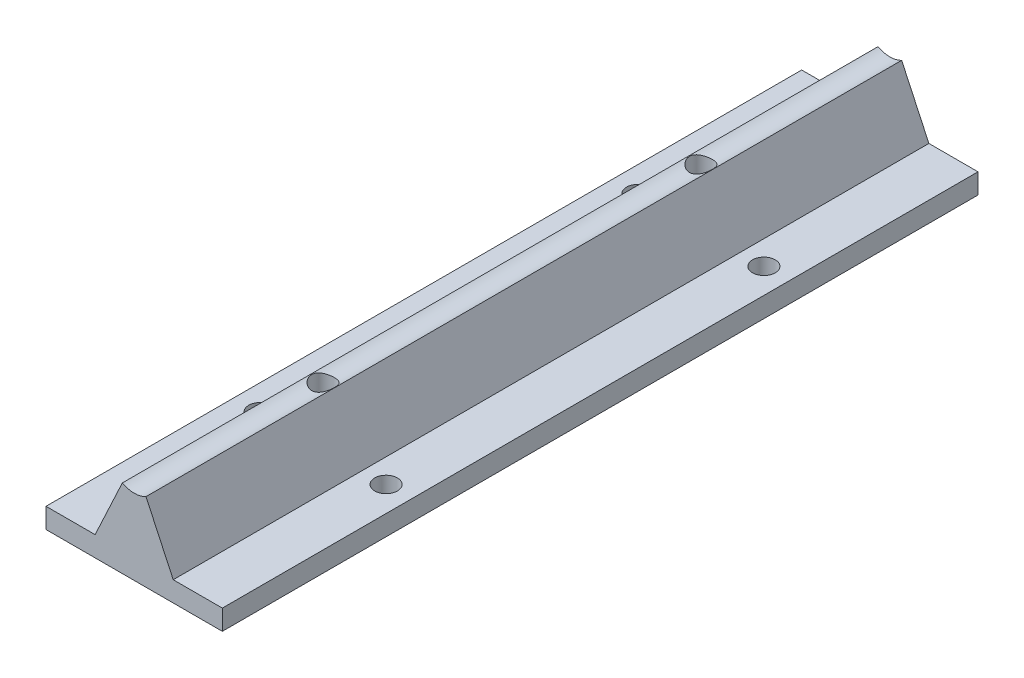
ISO-10303-21;
HEADER;
FILE_DESCRIPTION(('STEP AP214'),'2;1');
FILE_NAME('part.step','',(''),(''),'','','');
FILE_SCHEMA(('AUTOMOTIVE_DESIGN { 1 0 10303 214 1 1 1 1 }'));
ENDSEC;
DATA;
#1=APPLICATION_CONTEXT('core data for automotive mechanical design processes');
#2=APPLICATION_PROTOCOL_DEFINITION('international standard','automotive_design',2000,#1);
#3=PRODUCT_CONTEXT('',#1,'mechanical');
#4=PRODUCT('Part','Part','',(#3));
#5=PRODUCT_RELATED_PRODUCT_CATEGORY('part','',(#4));
#6=PRODUCT_DEFINITION_FORMATION('','',#4);
#7=PRODUCT_DEFINITION_CONTEXT('part definition',#1,'design');
#8=PRODUCT_DEFINITION('design','',#6,#7);
#9=PRODUCT_DEFINITION_SHAPE('','',#8);
#10=(LENGTH_UNIT() NAMED_UNIT(*) SI_UNIT(.MILLI.,.METRE.));
#11=(NAMED_UNIT(*) PLANE_ANGLE_UNIT() SI_UNIT($,.RADIAN.));
#12=(NAMED_UNIT(*) SI_UNIT($,.STERADIAN.) SOLID_ANGLE_UNIT());
#13=UNCERTAINTY_MEASURE_WITH_UNIT(LENGTH_MEASURE(1.E-05),#10,'distance_accuracy_value','');
#14=(GEOMETRIC_REPRESENTATION_CONTEXT(3) GLOBAL_UNCERTAINTY_ASSIGNED_CONTEXT((#13)) GLOBAL_UNIT_ASSIGNED_CONTEXT((#10,
#11,#12)) REPRESENTATION_CONTEXT('',''));
#15=CARTESIAN_POINT('',(0.,0.,0.));
#16=DIRECTION('',(0.,0.,1.));
#17=DIRECTION('',(1.,0.,0.));
#18=AXIS2_PLACEMENT_3D('',#15,#16,#17);
#19=CARTESIAN_POINT('',(0.,0.,-150.));
#20=DIRECTION('',(0.,0.,1.));
#21=DIRECTION('',(1.,0.,0.));
#22=AXIS2_PLACEMENT_3D('',#19,#20,#21);
#23=CYLINDRICAL_SURFACE('',#22,5.);
#24=CARTESIAN_POINT('',(2.25,-4.46514277487294,-37.5));
#25=CARTESIAN_POINT('',(2.24999304031583,-4.46515039872742,-37.3810387872691));
#26=CARTESIAN_POINT('',(2.24050444334664,-4.4699666726898,-37.2618852197389));
#27=CARTESIAN_POINT('',(2.20296952025722,-4.48857891323592,-37.0271018284973));
#28=CARTESIAN_POINT('',(2.17487687589,-4.50239729083484,-36.9114815551227));
#29=CARTESIAN_POINT('',(2.10149811494296,-4.53710585458752,-36.6875840285442));
#30=CARTESIAN_POINT('',(2.05629003690716,-4.55796389692775,-36.579276037285));
#31=CARTESIAN_POINT('',(1.95019826041788,-4.6043530345761,-36.371809245018));
#32=CARTESIAN_POINT('',(1.88931647308661,-4.62988356005072,-36.2726493305705));
#33=CARTESIAN_POINT('',(1.74886682448111,-4.6848168738739,-36.0790152310073));
#34=CARTESIAN_POINT('',(1.66832919766814,-4.71436409953233,-35.9852850632113));
#35=CARTESIAN_POINT('',(1.49288314705885,-4.77282391954203,-35.8121009236461));
#36=CARTESIAN_POINT('',(1.39796864967689,-4.80173623973545,-35.7326530166617));
#37=CARTESIAN_POINT('',(1.19040340238111,-4.85747480215182,-35.5862642005538));
#38=CARTESIAN_POINT('',(1.0770863493284,-4.88411395697375,-35.5201902456851));
#39=CARTESIAN_POINT('',(0.839526009772626,-4.93049745168418,-35.4083730190249));
#40=CARTESIAN_POINT('',(0.715288381409388,-4.95024533600557,-35.3626192924835));
#41=CARTESIAN_POINT('',(0.467253632116483,-4.97959116820759,-35.2955312718054));
#42=CARTESIAN_POINT('',(0.343870281116731,-4.98972320525301,-35.2729058054981));
#43=CARTESIAN_POINT('',(0.0946715176300412,-5.00065622282591,-35.2485139386555));
#44=CARTESIAN_POINT('',(-0.0311427027271375,-5.00146166644926,-35.2467375611082));
#45=CARTESIAN_POINT('',(-0.272124930597736,-4.99394241822247,-35.2634846149598));
#46=CARTESIAN_POINT('',(-0.387416232492517,-4.98625984599743,-35.2805802947329));
#47=CARTESIAN_POINT('',(-0.613288459239055,-4.96354367577184,-35.3320981851849));
#48=CARTESIAN_POINT('',(-0.723869034338141,-4.94850953297701,-35.3665216799616));
#49=CARTESIAN_POINT('',(-0.939228995401037,-4.91222614034771,-35.4520780505759));
#50=CARTESIAN_POINT('',(-1.04389475376014,-4.8908859566015,-35.5034567865346));
#51=CARTESIAN_POINT('',(-1.24339321925694,-4.84401587857545,-35.6211962951282));
#52=CARTESIAN_POINT('',(-1.3382223125092,-4.81848445331244,-35.6875625457658));
#53=CARTESIAN_POINT('',(-1.52345175293302,-4.76331481407976,-35.8395558357204));
#54=CARTESIAN_POINT('',(-1.61288673432273,-4.73351145466938,-35.92630082335));
#55=CARTESIAN_POINT('',(-1.77639992608746,-4.67460929075157,-36.1135073005329));
#56=CARTESIAN_POINT('',(-1.85047011655517,-4.6455108611573,-36.2139759082102));
#57=CARTESIAN_POINT('',(-1.9842398101775,-4.59001891824128,-36.4312356755283));
#58=CARTESIAN_POINT('',(-2.04317215242966,-4.56379860249299,-36.548547437004));
#59=CARTESIAN_POINT('',(-2.14003834281189,-4.51919374197597,-36.7929140470942));
#60=CARTESIAN_POINT('',(-2.17799005773757,-4.50080253313332,-36.919960500469));
#61=CARTESIAN_POINT('',(-2.22914248632389,-4.47567706017381,-37.1704937388217));
#62=CARTESIAN_POINT('',(-2.24392437246759,-4.46820077828806,-37.2935813806313));
#63=CARTESIAN_POINT('',(-2.25302242470034,-4.46362263539942,-37.5406793100698));
#64=CARTESIAN_POINT('',(-2.2473478942298,-4.46651605832117,-37.664689152686));
#65=CARTESIAN_POINT('',(-2.21714216163569,-4.48157509018498,-37.8996001648764));
#66=CARTESIAN_POINT('',(-2.19415743855621,-4.49297960430386,-38.0107558097788));
#67=CARTESIAN_POINT('',(-2.13212542419366,-4.52274424903303,-38.2274996545956));
#68=CARTESIAN_POINT('',(-2.09307393216707,-4.54110619860308,-38.3330863903371));
#69=CARTESIAN_POINT('',(-1.99809284583429,-4.58371481317643,-38.5410481707792));
#70=CARTESIAN_POINT('',(-1.94148122987605,-4.60818960972128,-38.6430633649459));
#71=CARTESIAN_POINT('',(-1.81362927889096,-4.65998955680979,-38.8366836138209));
#72=CARTESIAN_POINT('',(-1.74238196666509,-4.68731606376624,-38.9282836708995));
#73=CARTESIAN_POINT('',(-1.57908877421524,-4.74496334454854,-39.1078255379359));
#74=CARTESIAN_POINT('',(-1.48568977503588,-4.77531541652934,-39.194531895157));
#75=CARTESIAN_POINT('',(-1.28502997436725,-4.8331762481073,-39.351326543911));
#76=CARTESIAN_POINT('',(-1.17776699723161,-4.86068456021687,-39.4214122222902));
#77=CARTESIAN_POINT('',(-0.950682209086048,-4.91017542897077,-39.5433961414959));
#78=CARTESIAN_POINT('',(-0.830745952505896,-4.93210022008002,-39.5951062823748));
#79=CARTESIAN_POINT('',(-0.582619539391229,-4.96751583574373,-39.6771762488785));
#80=CARTESIAN_POINT('',(-0.454435271872218,-4.98101260572729,-39.7075511270571));
#81=CARTESIAN_POINT('',(-0.204394813787128,-4.99726613498169,-39.7439710415703));
#82=CARTESIAN_POINT('',(-0.0828396086643638,-5.00078768109045,-39.7517498349332));
#83=CARTESIAN_POINT('',(0.159848279708581,-4.99891579804308,-39.7475911911414));
#84=CARTESIAN_POINT('',(0.280981054375446,-4.99352443536979,-39.7356583241909));
#85=CARTESIAN_POINT('',(0.513549488452865,-4.97486307031119,-39.6936476316652));
#86=CARTESIAN_POINT('',(0.625174452755547,-4.96196940870592,-39.6644355034439));
#87=CARTESIAN_POINT('',(0.841845251095443,-4.92983796875448,-39.589721662337));
#88=CARTESIAN_POINT('',(0.946889948144515,-4.9105990976134,-39.5442171434013));
#89=CARTESIAN_POINT('',(1.1527517065352,-4.86649288960106,-39.4359251090506));
#90=CARTESIAN_POINT('',(1.25315478757822,-4.84140812281739,-39.3724414763288));
#91=CARTESIAN_POINT('',(1.4423245633934,-4.78846161065104,-39.2309445814171));
#92=CARTESIAN_POINT('',(1.53108621316286,-4.76059867044869,-39.1529250550821));
#93=CARTESIAN_POINT('',(1.70196716671107,-4.70235094807989,-38.9771636475261));
#94=CARTESIAN_POINT('',(1.78296764783157,-4.67194455656386,-38.8783366721409));
#95=CARTESIAN_POINT('',(1.92749297632142,-4.61420006725822,-38.6677352006364));
#96=CARTESIAN_POINT('',(1.99100658915978,-4.58686394862663,-38.5559524462233));
#97=CARTESIAN_POINT('',(2.09879543180337,-4.53856864513167,-38.3211515361848));
#98=CARTESIAN_POINT('',(2.14295192965231,-4.51764904631087,-38.19806949051));
#99=CARTESIAN_POINT('',(2.19275164773714,-4.49356898894665,-38.0085450162447));
#100=CARTESIAN_POINT('',(2.20660710269014,-4.48676181351279,-37.9446151097391));
#101=CARTESIAN_POINT('',(2.22871677888322,-4.47582163437334,-37.8155836028458));
#102=CARTESIAN_POINT('',(2.23697517989221,-4.47168663524699,-37.7504829141542));
#103=CARTESIAN_POINT('',(2.2449126944791,-4.46770340658946,-37.6543423353983));
#104=CARTESIAN_POINT('',(2.24681915664303,-4.46674464896162,-37.6235140886301));
#105=CARTESIAN_POINT('',(2.24936373361879,-4.46546333269431,-37.5617948896694));
#106=CARTESIAN_POINT('',(2.25000180799797,-4.46514079433574,-37.5309039355094));
#107=CARTESIAN_POINT('',(2.25,-4.46514277487294,-37.5));
#108=B_SPLINE_CURVE_WITH_KNOTS('',3,(#24,#25,#26,#27,#28,#29,#30,#31,#32,#33,#34,#35,#36,#37,
#38,#39,#40,#41,#42,#43,#44,#45,#46,#47,#48,#49,#50,#51,#52,#53,#54,#55,#56,#57,#58,#59,#60,#61,
#62,#63,#64,#65,#66,#67,#68,#69,#70,#71,#72,#73,#74,#75,#76,#77,#78,#79,#80,#81,#82,#83,#84,#85,
#86,#87,#88,#89,#90,#91,#92,#93,#94,#95,#96,#97,#98,#99,#100,#101,#102,#103,#104,#105,#106,
#107),.UNSPECIFIED.,.T.,.F.,(4,2,2,2,2,2,2,2,2,2,2,2,2,2,2,2,2,2,2,2,2,2,2,2,2,2,2,2,2,2,2,2,2,
2,2,2,2,2,2,2,2,4),(0.,0.356759742987548,0.714411062073144,1.07045091984824,1.42644738561851,
1.80599601944598,2.18570544513355,2.58519198578237,2.98447275197118,3.35999219707463,
3.73533193577185,4.08410830185014,4.43291051821014,4.78701075889259,5.14124063485553,
5.52388400014615,5.90672659268635,6.30625734447515,6.70544733553703,7.0759816733518,
7.44634751591088,7.78705357899948,8.12784877819472,8.48402022975506,8.84036187276862,
9.23157909435329,9.62285778358307,10.0180336177098,10.412930364732,10.7766046049827,
11.1401945381678,11.4869501554105,11.8337655233701,12.1964652511595,12.5593216450042,
12.9515422543472,13.3440142630044,13.7388610212111,13.9359176589375,14.1328269760451,
14.2255036426529,14.318183263485),.UNSPECIFIED.);
#109=CARTESIAN_POINT('',(2.25,-4.46514277487294,-37.5));
#110=VERTEX_POINT('',#109);
#111=EDGE_CURVE('E45',#110,#110,#108,.T.);
#112=ORIENTED_EDGE('',*,*,#111,.T.);
#113=EDGE_LOOP('',(#112));
#114=FACE_BOUND('',#113,.T.);
#115=CARTESIAN_POINT('',(0.,0.,0.));
#116=DIRECTION('',(0.,0.,-1.));
#117=DIRECTION('',(1.,0.,0.));
#118=AXIS2_PLACEMENT_3D('',#115,#116,#117);
#119=CIRCLE('',#118,5.);
#120=CARTESIAN_POINT('',(2.35,-4.41333207452147,0.));
#121=VERTEX_POINT('',#120);
#122=CARTESIAN_POINT('',(-2.35,-4.41333207452147,0.));
#123=VERTEX_POINT('',#122);
#124=EDGE_CURVE('E136',#121,#123,#119,.T.);
#125=ORIENTED_EDGE('',*,*,#124,.F.);
#126=DIRECTION('',(0.,0.,1.));
#127=VECTOR('',#126,1.);
#128=CARTESIAN_POINT('',(2.35,-4.41333207452147,-150.));
#129=LINE('',#128,#127);
#130=CARTESIAN_POINT('',(2.35,-4.41333207452147,-150.));
#131=VERTEX_POINT('',#130);
#132=EDGE_CURVE('E53',#131,#121,#129,.T.);
#133=ORIENTED_EDGE('',*,*,#132,.F.);
#134=CARTESIAN_POINT('',(0.,0.,-150.));
#135=DIRECTION('',(0.,0.,-1.));
#136=DIRECTION('',(1.,0.,0.));
#137=AXIS2_PLACEMENT_3D('',#134,#135,#136);
#138=CIRCLE('',#137,5.);
#139=CARTESIAN_POINT('',(-2.35,-4.41333207452147,-150.));
#140=VERTEX_POINT('',#139);
#141=EDGE_CURVE('E158',#131,#140,#138,.T.);
#142=ORIENTED_EDGE('',*,*,#141,.T.);
#143=DIRECTION('',(0.,0.,1.));
#144=VECTOR('',#143,1.);
#145=CARTESIAN_POINT('',(-2.35,-4.41333207452147,-150.));
#146=LINE('',#145,#144);
#147=EDGE_CURVE('E94',#140,#123,#146,.T.);
#148=ORIENTED_EDGE('',*,*,#147,.T.);
#149=EDGE_LOOP('',(#125,#133,#142,#148));
#150=FACE_BOUND('',#149,.T.);
#151=CARTESIAN_POINT('',(2.25,-4.46514277487294,-112.5));
#152=CARTESIAN_POINT('',(2.24999304031583,-4.46515039872742,-112.381038787269));
#153=CARTESIAN_POINT('',(2.24050444334664,-4.4699666726898,-112.261885219739));
#154=CARTESIAN_POINT('',(2.20296952025721,-4.48857891323592,-112.027101828497));
#155=CARTESIAN_POINT('',(2.17487687588999,-4.50239729083484,-111.911481555123));
#156=CARTESIAN_POINT('',(2.10149811494296,-4.53710585458752,-111.687584028544));
#157=CARTESIAN_POINT('',(2.05629003690716,-4.55796389692775,-111.579276037285));
#158=CARTESIAN_POINT('',(1.95019826041789,-4.6043530345761,-111.371809245018));
#159=CARTESIAN_POINT('',(1.88931647308662,-4.62988356005071,-111.27264933057));
#160=CARTESIAN_POINT('',(1.74886682448113,-4.6848168738739,-111.079015231007));
#161=CARTESIAN_POINT('',(1.66832919766816,-4.71436409953233,-110.985285063211));
#162=CARTESIAN_POINT('',(1.49288314705886,-4.77282391954203,-110.812100923646));
#163=CARTESIAN_POINT('',(1.3979686496769,-4.80173623973545,-110.732653016662));
#164=CARTESIAN_POINT('',(1.19040340238111,-4.85747480215182,-110.586264200554));
#165=CARTESIAN_POINT('',(1.07708634932839,-4.88411395697375,-110.520190245685));
#166=CARTESIAN_POINT('',(0.839526009772622,-4.93049745168418,-110.408373019025));
#167=CARTESIAN_POINT('',(0.715288381409382,-4.95024533600557,-110.362619292483));
#168=CARTESIAN_POINT('',(0.467253632116477,-4.97959116820759,-110.295531271805));
#169=CARTESIAN_POINT('',(0.343870281116728,-4.98972320525301,-110.272905805498));
#170=CARTESIAN_POINT('',(0.0946715176300411,-5.00065622282591,-110.248513938655));
#171=CARTESIAN_POINT('',(-0.0311427027271368,-5.00146166644926,-110.246737561108));
#172=CARTESIAN_POINT('',(-0.272124930597734,-4.99394241822247,-110.26348461496));
#173=CARTESIAN_POINT('',(-0.387416232492514,-4.98625984599743,-110.280580294733));
#174=CARTESIAN_POINT('',(-0.613288459239052,-4.96354367577184,-110.332098185185));
#175=CARTESIAN_POINT('',(-0.723869034338138,-4.94850953297701,-110.366521679962));
#176=CARTESIAN_POINT('',(-0.939228995401038,-4.91222614034771,-110.452078050576));
#177=CARTESIAN_POINT('',(-1.04389475376015,-4.89088595660149,-110.503456786535));
#178=CARTESIAN_POINT('',(-1.24339321925695,-4.84401587857545,-110.621196295128));
#179=CARTESIAN_POINT('',(-1.3382223125092,-4.81848445331244,-110.687562545766));
#180=CARTESIAN_POINT('',(-1.52345175293302,-4.76331481407976,-110.83955583572));
#181=CARTESIAN_POINT('',(-1.61288673432273,-4.73351145466938,-110.92630082335));
#182=CARTESIAN_POINT('',(-1.77639992608746,-4.67460929075157,-111.113507300533));
#183=CARTESIAN_POINT('',(-1.85047011655517,-4.6455108611573,-111.21397590821));
#184=CARTESIAN_POINT('',(-1.9842398101775,-4.59001891824128,-111.431235675528));
#185=CARTESIAN_POINT('',(-2.04317215242967,-4.56379860249299,-111.548547437004));
#186=CARTESIAN_POINT('',(-2.1400383428119,-4.51919374197597,-111.792914047094));
#187=CARTESIAN_POINT('',(-2.17799005773757,-4.50080253313332,-111.919960500469));
#188=CARTESIAN_POINT('',(-2.22914248632389,-4.47567706017381,-112.170493738822));
#189=CARTESIAN_POINT('',(-2.24392437246759,-4.46820077828806,-112.293581380631));
#190=CARTESIAN_POINT('',(-2.25302242470034,-4.46362263539942,-112.54067931007));
#191=CARTESIAN_POINT('',(-2.2473478942298,-4.46651605832117,-112.664689152686));
#192=CARTESIAN_POINT('',(-2.21714216163569,-4.48157509018498,-112.899600164876));
#193=CARTESIAN_POINT('',(-2.19415743855621,-4.49297960430386,-113.010755809779));
#194=CARTESIAN_POINT('',(-2.13212542419366,-4.52274424903303,-113.227499654596));
#195=CARTESIAN_POINT('',(-2.09307393216707,-4.54110619860308,-113.333086390337));
#196=CARTESIAN_POINT('',(-1.9980928458343,-4.58371481317643,-113.541048170779));
#197=CARTESIAN_POINT('',(-1.94148122987606,-4.60818960972127,-113.643063364946));
#198=CARTESIAN_POINT('',(-1.81362927889096,-4.65998955680978,-113.836683613821));
#199=CARTESIAN_POINT('',(-1.74238196666509,-4.68731606376624,-113.9282836709));
#200=CARTESIAN_POINT('',(-1.57908877421524,-4.74496334454854,-114.107825537936));
#201=CARTESIAN_POINT('',(-1.48568977503588,-4.77531541652934,-114.194531895157));
#202=CARTESIAN_POINT('',(-1.28502997436725,-4.83317624810729,-114.351326543911));
#203=CARTESIAN_POINT('',(-1.17776699723162,-4.86068456021687,-114.42141222229));
#204=CARTESIAN_POINT('',(-0.950682209086051,-4.91017542897077,-114.543396141496));
#205=CARTESIAN_POINT('',(-0.830745952505899,-4.93210022008002,-114.595106282375));
#206=CARTESIAN_POINT('',(-0.582619539391233,-4.96751583574373,-114.677176248878));
#207=CARTESIAN_POINT('',(-0.45443527187222,-4.98101260572729,-114.707551127057));
#208=CARTESIAN_POINT('',(-0.204394813787129,-4.99726613498169,-114.74397104157));
#209=CARTESIAN_POINT('',(-0.0828396086643651,-5.00078768109045,-114.751749834933));
#210=CARTESIAN_POINT('',(0.159848279708579,-4.99891579804308,-114.747591191141));
#211=CARTESIAN_POINT('',(0.280981054375445,-4.99352443536979,-114.735658324191));
#212=CARTESIAN_POINT('',(0.513549488452862,-4.97486307031119,-114.693647631665));
#213=CARTESIAN_POINT('',(0.625174452755542,-4.96196940870592,-114.664435503444));
#214=CARTESIAN_POINT('',(0.841845251095437,-4.92983796875448,-114.589721662337));
#215=CARTESIAN_POINT('',(0.94688994814451,-4.9105990976134,-114.544217143401));
#216=CARTESIAN_POINT('',(1.1527517065352,-4.86649288960106,-114.435925109051));
#217=CARTESIAN_POINT('',(1.25315478757822,-4.84140812281739,-114.372441476329));
#218=CARTESIAN_POINT('',(1.4423245633934,-4.78846161065104,-114.230944581417));
#219=CARTESIAN_POINT('',(1.53108621316286,-4.76059867044869,-114.152925055082));
#220=CARTESIAN_POINT('',(1.70196716671107,-4.70235094807989,-113.977163647526));
#221=CARTESIAN_POINT('',(1.78296764783157,-4.67194455656386,-113.878336672141));
#222=CARTESIAN_POINT('',(1.92749297632142,-4.61420006725822,-113.667735200636));
#223=CARTESIAN_POINT('',(1.99100658915979,-4.58686394862663,-113.555952446223));
#224=CARTESIAN_POINT('',(2.09879543180338,-4.53856864513167,-113.321151536185));
#225=CARTESIAN_POINT('',(2.14295192965231,-4.51764904631087,-113.19806949051));
#226=CARTESIAN_POINT('',(2.19275164773714,-4.49356898894665,-113.008545016245));
#227=CARTESIAN_POINT('',(2.20660710269014,-4.48676181351279,-112.944615109739));
#228=CARTESIAN_POINT('',(2.22871677888322,-4.47582163437334,-112.815583602846));
#229=CARTESIAN_POINT('',(2.23697517989221,-4.47168663524699,-112.750482914154));
#230=CARTESIAN_POINT('',(2.2449126944791,-4.46770340658946,-112.654342335398));
#231=CARTESIAN_POINT('',(2.24681915664303,-4.46674464896162,-112.62351408863));
#232=CARTESIAN_POINT('',(2.24936373361879,-4.46546333269431,-112.561794889669));
#233=CARTESIAN_POINT('',(2.25000180799797,-4.46514079433574,-112.530903935509));
#234=CARTESIAN_POINT('',(2.25,-4.46514277487294,-112.5));
#235=B_SPLINE_CURVE_WITH_KNOTS('',3,(#151,#152,#153,#154,#155,#156,#157,#158,#159,#160,#161,
#162,#163,#164,#165,#166,#167,#168,#169,#170,#171,#172,#173,#174,#175,#176,#177,#178,#179,#180,
#181,#182,#183,#184,#185,#186,#187,#188,#189,#190,#191,#192,#193,#194,#195,#196,#197,#198,#199,
#200,#201,#202,#203,#204,#205,#206,#207,#208,#209,#210,#211,#212,#213,#214,#215,#216,#217,#218,
#219,#220,#221,#222,#223,#224,#225,#226,#227,#228,#229,#230,#231,#232,#233,#234),.UNSPECIFIED.,
.T.,.F.,(4,2,2,2,2,2,2,2,2,2,2,2,2,2,2,2,2,2,2,2,2,2,2,2,2,2,2,2,2,2,2,2,2,2,2,2,2,2,2,2,2,4),
(0.,0.356759742987555,0.714411062073144,1.07045091984822,1.42644738561848,1.80599601944596,
2.18570544513356,2.58519198578237,2.98447275197118,3.35999219707463,3.73533193577184,
4.08410830185014,4.43291051821014,4.78701075889259,5.14124063485553,5.52388400014614,
5.90672659268636,6.30625734447514,6.70544733553704,7.07598167335182,7.44634751591088,
7.78705357899946,8.12784877819469,8.48402022975503,8.84036187276861,9.23157909435328,
9.62285778358306,10.0180336177098,10.412930364732,10.7766046049827,11.1401945381678,
11.4869501554105,11.8337655233701,12.1964652511595,12.5593216450042,12.9515422543472,
13.3440142630044,13.7388610212111,13.9359176589375,14.1328269760451,14.2255036426529,
14.318183263485),.UNSPECIFIED.);
#236=CARTESIAN_POINT('',(2.25,-4.46514277487294,-112.5));
#237=VERTEX_POINT('',#236);
#238=EDGE_CURVE('E11',#237,#237,#235,.T.);
#239=ORIENTED_EDGE('',*,*,#238,.T.);
#240=EDGE_LOOP('',(#239));
#241=FACE_BOUND('',#240,.T.);
#242=ADVANCED_FACE('F32',(#114,#150,#241),#23,.F.);
#243=CARTESIAN_POINT('',(-17.5,-20.,-150.));
#244=DIRECTION('',(0.,-1.,0.));
#245=DIRECTION('',(1.,0.,0.));
#246=AXIS2_PLACEMENT_3D('',#243,#244,#245);
#247=PLANE('',#246);
#248=CARTESIAN_POINT('',(0.,-20.,-37.5));
#249=DIRECTION('',(0.,-1.,0.));
#250=DIRECTION('',(1.,0.,0.));
#251=AXIS2_PLACEMENT_3D('',#248,#249,#250);
#252=CIRCLE('',#251,3.15000000000001);
#253=CARTESIAN_POINT('',(3.15000000000001,-20.,-37.5));
#254=VERTEX_POINT('',#253);
#255=EDGE_CURVE('E265',#254,#254,#252,.T.);
#256=ORIENTED_EDGE('',*,*,#255,.F.);
#257=EDGE_LOOP('',(#256));
#258=FACE_BOUND('',#257,.T.);
#259=CARTESIAN_POINT('',(-12.5,-20.,-37.5));
#260=DIRECTION('',(0.,1.,0.));
#261=DIRECTION('',(0.,0.,1.));
#262=AXIS2_PLACEMENT_3D('',#259,#260,#261);
#263=CIRCLE('',#262,2.25);
#264=CARTESIAN_POINT('',(-12.5,-20.,-35.25));
#265=VERTEX_POINT('',#264);
#266=EDGE_CURVE('E173',#265,#265,#263,.T.);
#267=ORIENTED_EDGE('',*,*,#266,.T.);
#268=EDGE_LOOP('',(#267));
#269=FACE_BOUND('',#268,.T.);
#270=CARTESIAN_POINT('',(12.5,-20.,-37.5));
#271=DIRECTION('',(0.,1.,0.));
#272=DIRECTION('',(0.,0.,1.));
#273=AXIS2_PLACEMENT_3D('',#270,#271,#272);
#274=CIRCLE('',#273,2.25);
#275=CARTESIAN_POINT('',(12.5,-20.,-35.25));
#276=VERTEX_POINT('',#275);
#277=EDGE_CURVE('E172',#276,#276,#274,.T.);
#278=ORIENTED_EDGE('',*,*,#277,.T.);
#279=EDGE_LOOP('',(#278));
#280=FACE_BOUND('',#279,.T.);
#281=DIRECTION('',(1.,0.,0.));
#282=VECTOR('',#281,1.);
#283=CARTESIAN_POINT('',(-17.5,-20.,0.));
#284=LINE('',#283,#282);
#285=CARTESIAN_POINT('',(-17.5,-20.,0.));
#286=VERTEX_POINT('',#285);
#287=CARTESIAN_POINT('',(17.5,-20.,0.));
#288=VERTEX_POINT('',#287);
#289=EDGE_CURVE('E149',#286,#288,#284,.T.);
#290=ORIENTED_EDGE('',*,*,#289,.F.);
#291=DIRECTION('',(0.,0.,1.));
#292=VECTOR('',#291,1.);
#293=CARTESIAN_POINT('',(-17.5,-20.,-150.));
#294=LINE('',#293,#292);
#295=CARTESIAN_POINT('',(-17.5,-20.,-150.));
#296=VERTEX_POINT('',#295);
#297=EDGE_CURVE('E162',#296,#286,#294,.T.);
#298=ORIENTED_EDGE('',*,*,#297,.F.);
#299=DIRECTION('',(1.,0.,0.));
#300=VECTOR('',#299,1.);
#301=CARTESIAN_POINT('',(-17.5,-20.,-150.));
#302=LINE('',#301,#300);
#303=CARTESIAN_POINT('',(17.5,-20.,-150.));
#304=VERTEX_POINT('',#303);
#305=EDGE_CURVE('E129',#296,#304,#302,.T.);
#306=ORIENTED_EDGE('',*,*,#305,.T.);
#307=DIRECTION('',(0.,0.,1.));
#308=VECTOR('',#307,1.);
#309=CARTESIAN_POINT('',(17.5,-20.,-150.));
#310=LINE('',#309,#308);
#311=EDGE_CURVE('E118',#304,#288,#310,.T.);
#312=ORIENTED_EDGE('',*,*,#311,.T.);
#313=EDGE_LOOP('',(#290,#298,#306,#312));
#314=FACE_BOUND('',#313,.T.);
#315=CARTESIAN_POINT('',(12.5,-20.,-112.5));
#316=DIRECTION('',(0.,1.,0.));
#317=DIRECTION('',(0.,0.,1.));
#318=AXIS2_PLACEMENT_3D('',#315,#316,#317);
#319=CIRCLE('',#318,2.25);
#320=CARTESIAN_POINT('',(12.5,-20.,-110.25));
#321=VERTEX_POINT('',#320);
#322=EDGE_CURVE('E299',#321,#321,#319,.T.);
#323=ORIENTED_EDGE('',*,*,#322,.T.);
#324=EDGE_LOOP('',(#323));
#325=FACE_BOUND('',#324,.T.);
#326=CARTESIAN_POINT('',(-12.5,-20.,-112.5));
#327=DIRECTION('',(0.,1.,0.));
#328=DIRECTION('',(0.,0.,1.));
#329=AXIS2_PLACEMENT_3D('',#326,#327,#328);
#330=CIRCLE('',#329,2.25);
#331=CARTESIAN_POINT('',(-12.5,-20.,-110.25));
#332=VERTEX_POINT('',#331);
#333=EDGE_CURVE('E303',#332,#332,#330,.T.);
#334=ORIENTED_EDGE('',*,*,#333,.T.);
#335=EDGE_LOOP('',(#334));
#336=FACE_BOUND('',#335,.T.);
#337=CARTESIAN_POINT('',(0.,-20.,-112.5));
#338=DIRECTION('',(0.,-1.,0.));
#339=DIRECTION('',(1.,0.,0.));
#340=AXIS2_PLACEMENT_3D('',#337,#338,#339);
#341=CIRCLE('',#340,3.15000000000001);
#342=CARTESIAN_POINT('',(3.15000000000001,-20.,-112.5));
#343=VERTEX_POINT('',#342);
#344=EDGE_CURVE('E306',#343,#343,#341,.T.);
#345=ORIENTED_EDGE('',*,*,#344,.F.);
#346=EDGE_LOOP('',(#345));
#347=FACE_BOUND('',#346,.T.);
#348=ADVANCED_FACE('F207',(#258,#269,#280,#314,#325,#336,#347),#247,.T.);
#349=CARTESIAN_POINT('',(2.35,-4.41333207452147,-150.));
#350=DIRECTION('',(0.906307787036649,0.4226182617407,0.));
#351=DIRECTION('',(-0.4226182617407,0.906307787036649,0.));
#352=AXIS2_PLACEMENT_3D('',#349,#350,#351);
#353=PLANE('',#352);
#354=DIRECTION('',(-0.4226182617407,0.906307787036649,0.));
#355=VECTOR('',#354,1.);
#356=CARTESIAN_POINT('',(2.35,-4.41333207452147,0.));
#357=LINE('',#356,#355);
#358=CARTESIAN_POINT('',(7.75295198614954,-16.,0.));
#359=VERTEX_POINT('',#358);
#360=EDGE_CURVE('E155',#359,#121,#357,.T.);
#361=ORIENTED_EDGE('',*,*,#360,.F.);
#362=DIRECTION('',(0.,0.,1.));
#363=VECTOR('',#362,1.);
#364=CARTESIAN_POINT('',(7.75295198614954,-16.,-150.));
#365=LINE('',#364,#363);
#366=CARTESIAN_POINT('',(7.75295198614954,-16.,-150.));
#367=VERTEX_POINT('',#366);
#368=EDGE_CURVE('E82',#367,#359,#365,.T.);
#369=ORIENTED_EDGE('',*,*,#368,.F.);
#370=DIRECTION('',(-0.4226182617407,0.906307787036649,0.));
#371=VECTOR('',#370,1.);
#372=CARTESIAN_POINT('',(2.35,-4.41333207452147,-150.));
#373=LINE('',#372,#371);
#374=EDGE_CURVE('E126',#367,#131,#373,.T.);
#375=ORIENTED_EDGE('',*,*,#374,.T.);
#376=ORIENTED_EDGE('',*,*,#132,.T.);
#377=EDGE_LOOP('',(#361,#369,#375,#376));
#378=FACE_BOUND('',#377,.T.);
#379=ADVANCED_FACE('F204',(#378),#353,.T.);
#380=CARTESIAN_POINT('',(7.75295198614954,-16.,-150.));
#381=DIRECTION('',(0.,1.,0.));
#382=DIRECTION('',(-1.,0.,0.));
#383=AXIS2_PLACEMENT_3D('',#380,#381,#382);
#384=PLANE('',#383);
#385=CARTESIAN_POINT('',(12.5,-16.,-112.5));
#386=DIRECTION('',(0.,1.,0.));
#387=DIRECTION('',(-1.,0.,0.));
#388=AXIS2_PLACEMENT_3D('',#385,#386,#387);
#389=CIRCLE('',#388,2.25);
#390=CARTESIAN_POINT('',(10.25,-16.,-112.5));
#391=VERTEX_POINT('',#390);
#392=EDGE_CURVE('E180',#391,#391,#389,.T.);
#393=ORIENTED_EDGE('',*,*,#392,.F.);
#394=EDGE_LOOP('',(#393));
#395=FACE_BOUND('',#394,.T.);
#396=CARTESIAN_POINT('',(12.5,-16.,-37.5));
#397=DIRECTION('',(0.,1.,0.));
#398=DIRECTION('',(-1.,0.,0.));
#399=AXIS2_PLACEMENT_3D('',#396,#397,#398);
#400=CIRCLE('',#399,2.25);
#401=CARTESIAN_POINT('',(10.25,-16.,-37.5));
#402=VERTEX_POINT('',#401);
#403=EDGE_CURVE('E140',#402,#402,#400,.T.);
#404=ORIENTED_EDGE('',*,*,#403,.F.);
#405=EDGE_LOOP('',(#404));
#406=FACE_BOUND('',#405,.T.);
#407=DIRECTION('',(-1.,0.,0.));
#408=VECTOR('',#407,1.);
#409=CARTESIAN_POINT('',(7.75295198614954,-16.,0.));
#410=LINE('',#409,#408);
#411=CARTESIAN_POINT('',(17.5,-16.,0.));
#412=VERTEX_POINT('',#411);
#413=EDGE_CURVE('E113',#412,#359,#410,.T.);
#414=ORIENTED_EDGE('',*,*,#413,.F.);
#415=DIRECTION('',(0.,0.,1.));
#416=VECTOR('',#415,1.);
#417=CARTESIAN_POINT('',(17.5,-16.,-150.));
#418=LINE('',#417,#416);
#419=CARTESIAN_POINT('',(17.5,-16.,-150.));
#420=VERTEX_POINT('',#419);
#421=EDGE_CURVE('E108',#420,#412,#418,.T.);
#422=ORIENTED_EDGE('',*,*,#421,.F.);
#423=DIRECTION('',(-1.,0.,0.));
#424=VECTOR('',#423,1.);
#425=CARTESIAN_POINT('',(7.75295198614954,-16.,-150.));
#426=LINE('',#425,#424);
#427=EDGE_CURVE('E111',#420,#367,#426,.T.);
#428=ORIENTED_EDGE('',*,*,#427,.T.);
#429=ORIENTED_EDGE('',*,*,#368,.T.);
#430=EDGE_LOOP('',(#414,#422,#428,#429));
#431=FACE_BOUND('',#430,.T.);
#432=ADVANCED_FACE('F110',(#395,#406,#431),#384,.T.);
#433=CARTESIAN_POINT('',(17.5,-16.,-150.));
#434=DIRECTION('',(1.,0.,0.));
#435=DIRECTION('',(0.,0.,-1.));
#436=AXIS2_PLACEMENT_3D('',#433,#434,#435);
#437=PLANE('',#436);
#438=DIRECTION('',(0.,1.,0.));
#439=VECTOR('',#438,1.);
#440=CARTESIAN_POINT('',(17.5,-16.,0.));
#441=LINE('',#440,#439);
#442=EDGE_CURVE('E152',#288,#412,#441,.T.);
#443=ORIENTED_EDGE('',*,*,#442,.F.);
#444=ORIENTED_EDGE('',*,*,#311,.F.);
#445=DIRECTION('',(0.,1.,0.));
#446=VECTOR('',#445,1.);
#447=CARTESIAN_POINT('',(17.5,-16.,-150.));
#448=LINE('',#447,#446);
#449=EDGE_CURVE('E124',#304,#420,#448,.T.);
#450=ORIENTED_EDGE('',*,*,#449,.T.);
#451=ORIENTED_EDGE('',*,*,#421,.T.);
#452=EDGE_LOOP('',(#443,#444,#450,#451));
#453=FACE_BOUND('',#452,.T.);
#454=ADVANCED_FACE('F128',(#453),#437,.T.);
#455=CARTESIAN_POINT('',(-17.5,-16.,-150.));
#456=DIRECTION('',(-1.,0.,0.));
#457=DIRECTION('',(0.,0.,1.));
#458=AXIS2_PLACEMENT_3D('',#455,#456,#457);
#459=PLANE('',#458);
#460=DIRECTION('',(0.,-1.,0.));
#461=VECTOR('',#460,1.);
#462=CARTESIAN_POINT('',(-17.5,-16.,0.));
#463=LINE('',#462,#461);
#464=CARTESIAN_POINT('',(-17.5,-16.,0.));
#465=VERTEX_POINT('',#464);
#466=EDGE_CURVE('E146',#465,#286,#463,.T.);
#467=ORIENTED_EDGE('',*,*,#466,.F.);
#468=DIRECTION('',(0.,0.,1.));
#469=VECTOR('',#468,1.);
#470=CARTESIAN_POINT('',(-17.5,-16.,-150.));
#471=LINE('',#470,#469);
#472=CARTESIAN_POINT('',(-17.5,-16.,-150.));
#473=VERTEX_POINT('',#472);
#474=EDGE_CURVE('E164',#473,#465,#471,.T.);
#475=ORIENTED_EDGE('',*,*,#474,.F.);
#476=DIRECTION('',(0.,-1.,0.));
#477=VECTOR('',#476,1.);
#478=CARTESIAN_POINT('',(-17.5,-16.,-150.));
#479=LINE('',#478,#477);
#480=EDGE_CURVE('E131',#473,#296,#479,.T.);
#481=ORIENTED_EDGE('',*,*,#480,.T.);
#482=ORIENTED_EDGE('',*,*,#297,.T.);
#483=EDGE_LOOP('',(#467,#475,#481,#482));
#484=FACE_BOUND('',#483,.T.);
#485=ADVANCED_FACE('F213',(#484),#459,.T.);
#486=CARTESIAN_POINT('',(-7.75295198614954,-16.,-150.));
#487=DIRECTION('',(0.,1.,0.));
#488=DIRECTION('',(0.,0.,1.));
#489=AXIS2_PLACEMENT_3D('',#486,#487,#488);
#490=PLANE('',#489);
#491=CARTESIAN_POINT('',(-12.5,-16.,-112.5));
#492=DIRECTION('',(0.,1.,0.));
#493=DIRECTION('',(0.,0.,1.));
#494=AXIS2_PLACEMENT_3D('',#491,#492,#493);
#495=CIRCLE('',#494,2.25);
#496=CARTESIAN_POINT('',(-12.5,-16.,-110.25));
#497=VERTEX_POINT('',#496);
#498=EDGE_CURVE('E315',#497,#497,#495,.T.);
#499=ORIENTED_EDGE('',*,*,#498,.F.);
#500=EDGE_LOOP('',(#499));
#501=FACE_BOUND('',#500,.T.);
#502=CARTESIAN_POINT('',(-12.5,-16.,-37.5));
#503=DIRECTION('',(0.,1.,0.));
#504=DIRECTION('',(0.,0.,1.));
#505=AXIS2_PLACEMENT_3D('',#502,#503,#504);
#506=CIRCLE('',#505,2.25);
#507=CARTESIAN_POINT('',(-12.5,-16.,-35.25));
#508=VERTEX_POINT('',#507);
#509=EDGE_CURVE('E169',#508,#508,#506,.T.);
#510=ORIENTED_EDGE('',*,*,#509,.F.);
#511=EDGE_LOOP('',(#510));
#512=FACE_BOUND('',#511,.T.);
#513=DIRECTION('',(-1.,0.,0.));
#514=VECTOR('',#513,1.);
#515=CARTESIAN_POINT('',(-7.75295198614954,-16.,0.));
#516=LINE('',#515,#514);
#517=CARTESIAN_POINT('',(-7.75295198614954,-16.,0.));
#518=VERTEX_POINT('',#517);
#519=EDGE_CURVE('E143',#518,#465,#516,.T.);
#520=ORIENTED_EDGE('',*,*,#519,.F.);
#521=DIRECTION('',(0.,0.,1.));
#522=VECTOR('',#521,1.);
#523=CARTESIAN_POINT('',(-7.75295198614954,-16.,-150.));
#524=LINE('',#523,#522);
#525=CARTESIAN_POINT('',(-7.75295198614954,-16.,-150.));
#526=VERTEX_POINT('',#525);
#527=EDGE_CURVE('E166',#526,#518,#524,.T.);
#528=ORIENTED_EDGE('',*,*,#527,.F.);
#529=DIRECTION('',(-1.,0.,0.));
#530=VECTOR('',#529,1.);
#531=CARTESIAN_POINT('',(-7.75295198614954,-16.,-150.));
#532=LINE('',#531,#530);
#533=EDGE_CURVE('E285',#526,#473,#532,.T.);
#534=ORIENTED_EDGE('',*,*,#533,.T.);
#535=ORIENTED_EDGE('',*,*,#474,.T.);
#536=EDGE_LOOP('',(#520,#528,#534,#535));
#537=FACE_BOUND('',#536,.T.);
#538=ADVANCED_FACE('F219',(#501,#512,#537),#490,.T.);
#539=CARTESIAN_POINT('',(-2.35,-4.41333207452147,-150.));
#540=DIRECTION('',(-0.90630778703665,0.4226182617407,0.));
#541=DIRECTION('',(-0.4226182617407,-0.90630778703665,0.));
#542=AXIS2_PLACEMENT_3D('',#539,#540,#541);
#543=PLANE('',#542);
#544=DIRECTION('',(-0.4226182617407,-0.90630778703665,0.));
#545=VECTOR('',#544,1.);
#546=CARTESIAN_POINT('',(-2.35,-4.41333207452147,0.));
#547=LINE('',#546,#545);
#548=EDGE_CURVE('E139',#123,#518,#547,.T.);
#549=ORIENTED_EDGE('',*,*,#548,.F.);
#550=ORIENTED_EDGE('',*,*,#147,.F.);
#551=DIRECTION('',(-0.4226182617407,-0.90630778703665,0.));
#552=VECTOR('',#551,1.);
#553=CARTESIAN_POINT('',(-2.35,-4.41333207452147,-150.));
#554=LINE('',#553,#552);
#555=EDGE_CURVE('E283',#140,#526,#554,.T.);
#556=ORIENTED_EDGE('',*,*,#555,.T.);
#557=ORIENTED_EDGE('',*,*,#527,.T.);
#558=EDGE_LOOP('',(#549,#550,#556,#557));
#559=FACE_BOUND('',#558,.T.);
#560=ADVANCED_FACE('F200',(#559),#543,.T.);
#561=CARTESIAN_POINT('',(0.,0.,-150.));
#562=DIRECTION('',(0.,0.,1.));
#563=DIRECTION('',(1.,0.,0.));
#564=AXIS2_PLACEMENT_3D('',#561,#562,#563);
#565=PLANE('',#564);
#566=ORIENTED_EDGE('',*,*,#141,.F.);
#567=ORIENTED_EDGE('',*,*,#374,.F.);
#568=ORIENTED_EDGE('',*,*,#427,.F.);
#569=ORIENTED_EDGE('',*,*,#449,.F.);
#570=ORIENTED_EDGE('',*,*,#305,.F.);
#571=ORIENTED_EDGE('',*,*,#480,.F.);
#572=ORIENTED_EDGE('',*,*,#533,.F.);
#573=ORIENTED_EDGE('',*,*,#555,.F.);
#574=EDGE_LOOP('',(#566,#567,#568,#569,#570,#571,#572,#573));
#575=FACE_BOUND('',#574,.T.);
#576=ADVANCED_FACE('F122',(#575),#565,.F.);
#577=CARTESIAN_POINT('',(0.,0.,0.));
#578=DIRECTION('',(0.,0.,1.));
#579=DIRECTION('',(1.,0.,0.));
#580=AXIS2_PLACEMENT_3D('',#577,#578,#579);
#581=PLANE('',#580);
#582=ORIENTED_EDGE('',*,*,#124,.T.);
#583=ORIENTED_EDGE('',*,*,#548,.T.);
#584=ORIENTED_EDGE('',*,*,#519,.T.);
#585=ORIENTED_EDGE('',*,*,#466,.T.);
#586=ORIENTED_EDGE('',*,*,#289,.T.);
#587=ORIENTED_EDGE('',*,*,#442,.T.);
#588=ORIENTED_EDGE('',*,*,#413,.T.);
#589=ORIENTED_EDGE('',*,*,#360,.T.);
#590=EDGE_LOOP('',(#582,#583,#584,#585,#586,#587,#588,#589));
#591=FACE_BOUND('',#590,.T.);
#592=ADVANCED_FACE('F196',(#591),#581,.T.);
#593=CARTESIAN_POINT('',(12.5,-20.,-37.5));
#594=DIRECTION('',(0.,1.,0.));
#595=DIRECTION('',(0.,0.,1.));
#596=AXIS2_PLACEMENT_3D('',#593,#594,#595);
#597=CYLINDRICAL_SURFACE('',#596,2.25);
#598=ORIENTED_EDGE('',*,*,#403,.T.);
#599=EDGE_LOOP('',(#598));
#600=FACE_BOUND('',#599,.T.);
#601=ORIENTED_EDGE('',*,*,#277,.F.);
#602=EDGE_LOOP('',(#601));
#603=FACE_BOUND('',#602,.T.);
#604=ADVANCED_FACE('F192',(#600,#603),#597,.F.);
#605=CARTESIAN_POINT('',(-12.5,-20.,-37.5));
#606=DIRECTION('',(0.,1.,0.));
#607=DIRECTION('',(0.,0.,1.));
#608=AXIS2_PLACEMENT_3D('',#605,#606,#607);
#609=CYLINDRICAL_SURFACE('',#608,2.25);
#610=ORIENTED_EDGE('',*,*,#509,.T.);
#611=EDGE_LOOP('',(#610));
#612=FACE_BOUND('',#611,.T.);
#613=ORIENTED_EDGE('',*,*,#266,.F.);
#614=EDGE_LOOP('',(#613));
#615=FACE_BOUND('',#614,.T.);
#616=ADVANCED_FACE('F187',(#612,#615),#609,.F.);
#617=CARTESIAN_POINT('',(0.,-20.,-37.5));
#618=DIRECTION('',(0.,-1.,0.));
#619=DIRECTION('',(1.,0.,0.));
#620=AXIS2_PLACEMENT_3D('',#617,#618,#619);
#621=CYLINDRICAL_SURFACE('',#620,2.25);
#622=CARTESIAN_POINT('',(0.,-13.8151427748729,-37.5));
#623=DIRECTION('',(0.,-1.,0.));
#624=DIRECTION('',(1.,0.,0.));
#625=AXIS2_PLACEMENT_3D('',#622,#623,#624);
#626=CIRCLE('',#625,2.25);
#627=CARTESIAN_POINT('',(2.25,-13.8151427748729,-37.5));
#628=VERTEX_POINT('',#627);
#629=EDGE_CURVE('E269',#628,#628,#626,.T.);
#630=ORIENTED_EDGE('',*,*,#629,.T.);
#631=EDGE_LOOP('',(#630));
#632=FACE_BOUND('',#631,.T.);
#633=ORIENTED_EDGE('',*,*,#111,.F.);
#634=EDGE_LOOP('',(#633));
#635=FACE_BOUND('',#634,.T.);
#636=ADVANCED_FACE('F181',(#632,#635),#621,.F.);
#637=CARTESIAN_POINT('',(-2.25,-13.8151427748729,-37.5));
#638=DIRECTION('',(0.,-1.,0.));
#639=DIRECTION('',(1.,0.,0.));
#640=AXIS2_PLACEMENT_3D('',#637,#638,#639);
#641=PLANE('',#640);
#642=CARTESIAN_POINT('',(0.,-13.8151427748729,-37.5));
#643=DIRECTION('',(0.,-1.,0.));
#644=DIRECTION('',(1.,0.,0.));
#645=AXIS2_PLACEMENT_3D('',#642,#643,#644);
#646=CIRCLE('',#645,3.15);
#647=CARTESIAN_POINT('',(3.15000000000001,-13.8151427748729,-37.5));
#648=VERTEX_POINT('',#647);
#649=EDGE_CURVE('E268',#648,#648,#646,.T.);
#650=ORIENTED_EDGE('',*,*,#649,.T.);
#651=EDGE_LOOP('',(#650));
#652=FACE_BOUND('',#651,.T.);
#653=ORIENTED_EDGE('',*,*,#629,.F.);
#654=EDGE_LOOP('',(#653));
#655=FACE_BOUND('',#654,.T.);
#656=ADVANCED_FACE('F186',(#652,#655),#641,.T.);
#657=CARTESIAN_POINT('',(0.,-20.,-37.5));
#658=DIRECTION('',(0.,-1.,0.));
#659=DIRECTION('',(1.,0.,0.));
#660=AXIS2_PLACEMENT_3D('',#657,#658,#659);
#661=CYLINDRICAL_SURFACE('',#660,3.15);
#662=ORIENTED_EDGE('',*,*,#255,.T.);
#663=EDGE_LOOP('',(#662));
#664=FACE_BOUND('',#663,.T.);
#665=ORIENTED_EDGE('',*,*,#649,.F.);
#666=EDGE_LOOP('',(#665));
#667=FACE_BOUND('',#666,.T.);
#668=ADVANCED_FACE('F255',(#664,#667),#661,.F.);
#669=CARTESIAN_POINT('',(12.5,-20.,-112.5));
#670=DIRECTION('',(0.,1.,0.));
#671=DIRECTION('',(0.,0.,1.));
#672=AXIS2_PLACEMENT_3D('',#669,#670,#671);
#673=CYLINDRICAL_SURFACE('',#672,2.25);
#674=ORIENTED_EDGE('',*,*,#392,.T.);
#675=EDGE_LOOP('',(#674));
#676=FACE_BOUND('',#675,.T.);
#677=ORIENTED_EDGE('',*,*,#322,.F.);
#678=EDGE_LOOP('',(#677));
#679=FACE_BOUND('',#678,.T.);
#680=ADVANCED_FACE('F247',(#676,#679),#673,.F.);
#681=CARTESIAN_POINT('',(-12.5,-20.,-112.5));
#682=DIRECTION('',(0.,1.,0.));
#683=DIRECTION('',(0.,0.,1.));
#684=AXIS2_PLACEMENT_3D('',#681,#682,#683);
#685=CYLINDRICAL_SURFACE('',#684,2.25);
#686=ORIENTED_EDGE('',*,*,#498,.T.);
#687=EDGE_LOOP('',(#686));
#688=FACE_BOUND('',#687,.T.);
#689=ORIENTED_EDGE('',*,*,#333,.F.);
#690=EDGE_LOOP('',(#689));
#691=FACE_BOUND('',#690,.T.);
#692=ADVANCED_FACE('F238',(#688,#691),#685,.F.);
#693=CARTESIAN_POINT('',(0.,-20.,-112.5));
#694=DIRECTION('',(0.,-1.,0.));
#695=DIRECTION('',(1.,0.,0.));
#696=AXIS2_PLACEMENT_3D('',#693,#694,#695);
#697=CYLINDRICAL_SURFACE('',#696,2.25);
#698=CARTESIAN_POINT('',(0.,-13.8151427748729,-112.5));
#699=DIRECTION('',(0.,-1.,0.));
#700=DIRECTION('',(1.,0.,0.));
#701=AXIS2_PLACEMENT_3D('',#698,#699,#700);
#702=CIRCLE('',#701,2.25);
#703=CARTESIAN_POINT('',(2.25,-13.8151427748729,-112.5));
#704=VERTEX_POINT('',#703);
#705=EDGE_CURVE('E311',#704,#704,#702,.T.);
#706=ORIENTED_EDGE('',*,*,#705,.T.);
#707=EDGE_LOOP('',(#706));
#708=FACE_BOUND('',#707,.T.);
#709=ORIENTED_EDGE('',*,*,#238,.F.);
#710=EDGE_LOOP('',(#709));
#711=FACE_BOUND('',#710,.T.);
#712=ADVANCED_FACE('F235',(#708,#711),#697,.F.);
#713=CARTESIAN_POINT('',(-2.25,-13.8151427748729,-112.5));
#714=DIRECTION('',(0.,-1.,0.));
#715=DIRECTION('',(1.,0.,0.));
#716=AXIS2_PLACEMENT_3D('',#713,#714,#715);
#717=PLANE('',#716);
#718=CARTESIAN_POINT('',(0.,-13.8151427748729,-112.5));
#719=DIRECTION('',(0.,-1.,0.));
#720=DIRECTION('',(1.,0.,0.));
#721=AXIS2_PLACEMENT_3D('',#718,#719,#720);
#722=CIRCLE('',#721,3.15);
#723=CARTESIAN_POINT('',(3.15000000000001,-13.8151427748729,-112.5));
#724=VERTEX_POINT('',#723);
#725=EDGE_CURVE('E308',#724,#724,#722,.T.);
#726=ORIENTED_EDGE('',*,*,#725,.T.);
#727=EDGE_LOOP('',(#726));
#728=FACE_BOUND('',#727,.T.);
#729=ORIENTED_EDGE('',*,*,#705,.F.);
#730=EDGE_LOOP('',(#729));
#731=FACE_BOUND('',#730,.T.);
#732=ADVANCED_FACE('F237',(#728,#731),#717,.T.);
#733=CARTESIAN_POINT('',(0.,-20.,-112.5));
#734=DIRECTION('',(0.,-1.,0.));
#735=DIRECTION('',(1.,0.,0.));
#736=AXIS2_PLACEMENT_3D('',#733,#734,#735);
#737=CYLINDRICAL_SURFACE('',#736,3.15);
#738=ORIENTED_EDGE('',*,*,#344,.T.);
#739=EDGE_LOOP('',(#738));
#740=FACE_BOUND('',#739,.T.);
#741=ORIENTED_EDGE('',*,*,#725,.F.);
#742=EDGE_LOOP('',(#741));
#743=FACE_BOUND('',#742,.T.);
#744=ADVANCED_FACE('F244',(#740,#743),#737,.F.);
#745=CLOSED_SHELL('',(#242,#348,#379,#432,#454,#485,#538,#560,#576,#592,#604,#616,#636,#656,
#668,#680,#692,#712,#732,#744));
#746=MANIFOLD_SOLID_BREP('B2',#745);
#747=ADVANCED_BREP_SHAPE_REPRESENTATION('',(#18,#746),#14);
#748=SHAPE_DEFINITION_REPRESENTATION(#9,#747);
ENDSEC;
END-ISO-10303-21;
